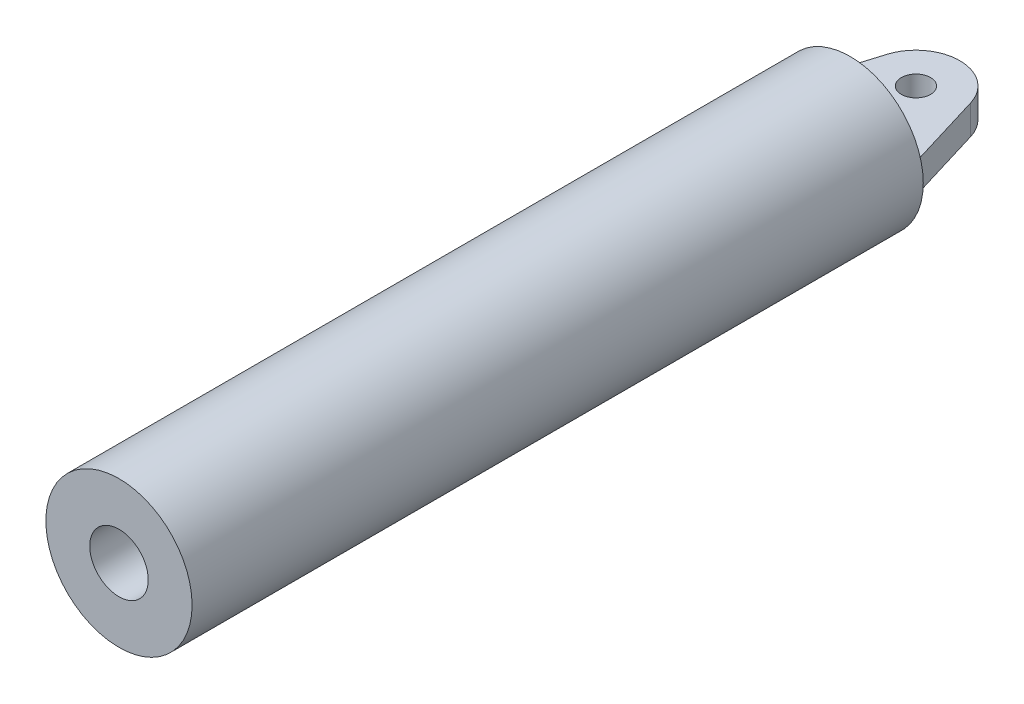
ISO-10303-21;
HEADER;
FILE_DESCRIPTION(('STEP AP214'),'2;1');
FILE_NAME('part.step','',(''),(''),'','','');
FILE_SCHEMA(('AUTOMOTIVE_DESIGN { 1 0 10303 214 1 1 1 1 }'));
ENDSEC;
DATA;
#1=APPLICATION_CONTEXT('core data for automotive mechanical design processes');
#2=APPLICATION_PROTOCOL_DEFINITION('international standard','automotive_design',2000,#1);
#3=PRODUCT_CONTEXT('',#1,'mechanical');
#4=PRODUCT('Part','Part','',(#3));
#5=PRODUCT_RELATED_PRODUCT_CATEGORY('part','',(#4));
#6=PRODUCT_DEFINITION_FORMATION('','',#4);
#7=PRODUCT_DEFINITION_CONTEXT('part definition',#1,'design');
#8=PRODUCT_DEFINITION('design','',#6,#7);
#9=PRODUCT_DEFINITION_SHAPE('','',#8);
#10=(LENGTH_UNIT() NAMED_UNIT(*) SI_UNIT(.MILLI.,.METRE.));
#11=(NAMED_UNIT(*) PLANE_ANGLE_UNIT() SI_UNIT($,.RADIAN.));
#12=(NAMED_UNIT(*) SI_UNIT($,.STERADIAN.) SOLID_ANGLE_UNIT());
#13=UNCERTAINTY_MEASURE_WITH_UNIT(LENGTH_MEASURE(1.E-05),#10,'distance_accuracy_value','');
#14=(GEOMETRIC_REPRESENTATION_CONTEXT(3) GLOBAL_UNCERTAINTY_ASSIGNED_CONTEXT((#13)) GLOBAL_UNIT_ASSIGNED_CONTEXT((#10,
#11,#12)) REPRESENTATION_CONTEXT('',''));
#15=CARTESIAN_POINT('',(0.,0.,0.));
#16=DIRECTION('',(0.,0.,1.));
#17=DIRECTION('',(1.,0.,0.));
#18=AXIS2_PLACEMENT_3D('',#15,#16,#17);
#19=CARTESIAN_POINT('',(0.,0.,0.));
#20=DIRECTION('',(0.,0.,1.));
#21=DIRECTION('',(1.,0.,0.));
#22=AXIS2_PLACEMENT_3D('',#19,#20,#21);
#23=PLANE('',#22);
#24=CARTESIAN_POINT('',(0.,0.,0.));
#25=DIRECTION('',(0.,0.,1.));
#26=DIRECTION('',(1.,0.,0.));
#27=AXIS2_PLACEMENT_3D('',#24,#25,#26);
#28=CIRCLE('',#27,50.);
#29=CARTESIAN_POINT('',(50.,0.,0.));
#30=VERTEX_POINT('',#29);
#31=EDGE_CURVE('E36',#30,#30,#28,.T.);
#32=ORIENTED_EDGE('',*,*,#31,.F.);
#33=EDGE_LOOP('',(#32));
#34=FACE_BOUND('',#33,.T.);
#35=DIRECTION('',(0.,-1.,0.));
#36=VECTOR('',#35,1.);
#37=CARTESIAN_POINT('',(45.,10.,0.));
#38=LINE('',#37,#36);
#39=CARTESIAN_POINT('',(45.,10.,0.));
#40=VERTEX_POINT('',#39);
#41=CARTESIAN_POINT('',(45.,-10.,0.));
#42=VERTEX_POINT('',#41);
#43=EDGE_CURVE('E47',#40,#42,#38,.T.);
#44=ORIENTED_EDGE('',*,*,#43,.F.);
#45=DIRECTION('',(1.,0.,0.));
#46=VECTOR('',#45,1.);
#47=CARTESIAN_POINT('',(-45.,10.,0.));
#48=LINE('',#47,#46);
#49=CARTESIAN_POINT('',(-45.,10.,0.));
#50=VERTEX_POINT('',#49);
#51=EDGE_CURVE('E79',#50,#40,#48,.T.);
#52=ORIENTED_EDGE('',*,*,#51,.F.);
#53=DIRECTION('',(0.,-1.,0.));
#54=VECTOR('',#53,1.);
#55=CARTESIAN_POINT('',(-45.,10.,0.));
#56=LINE('',#55,#54);
#57=CARTESIAN_POINT('',(-45.,-10.,0.));
#58=VERTEX_POINT('',#57);
#59=EDGE_CURVE('E95',#50,#58,#56,.T.);
#60=ORIENTED_EDGE('',*,*,#59,.T.);
#61=DIRECTION('',(1.,0.,0.));
#62=VECTOR('',#61,1.);
#63=CARTESIAN_POINT('',(-45.,-10.,0.));
#64=LINE('',#63,#62);
#65=EDGE_CURVE('E52',#58,#42,#64,.T.);
#66=ORIENTED_EDGE('',*,*,#65,.T.);
#67=EDGE_LOOP('',(#44,#52,#60,#66));
#68=FACE_BOUND('',#67,.T.);
#69=ADVANCED_FACE('F32',(#34,#68),#23,.F.);
#70=CARTESIAN_POINT('',(0.,0.,500.));
#71=DIRECTION('',(0.,0.,-1.));
#72=DIRECTION('',(-1.,0.,0.));
#73=AXIS2_PLACEMENT_3D('',#70,#71,#72);
#74=CYLINDRICAL_SURFACE('',#73,50.);
#75=CARTESIAN_POINT('',(0.,0.,500.));
#76=DIRECTION('',(0.,0.,1.));
#77=DIRECTION('',(1.,0.,0.));
#78=AXIS2_PLACEMENT_3D('',#75,#76,#77);
#79=CIRCLE('',#78,50.);
#80=CARTESIAN_POINT('',(50.,0.,500.));
#81=VERTEX_POINT('',#80);
#82=EDGE_CURVE('E11',#81,#81,#79,.T.);
#83=ORIENTED_EDGE('',*,*,#82,.F.);
#84=EDGE_LOOP('',(#83));
#85=FACE_BOUND('',#84,.T.);
#86=ORIENTED_EDGE('',*,*,#31,.T.);
#87=EDGE_LOOP('',(#86));
#88=FACE_BOUND('',#87,.T.);
#89=ADVANCED_FACE('F34',(#85,#88),#74,.T.);
#90=CARTESIAN_POINT('',(0.,0.,500.));
#91=DIRECTION('',(0.,0.,1.));
#92=DIRECTION('',(1.,0.,0.));
#93=AXIS2_PLACEMENT_3D('',#90,#91,#92);
#94=PLANE('',#93);
#95=CARTESIAN_POINT('',(0.,0.,500.));
#96=DIRECTION('',(0.,0.,1.));
#97=DIRECTION('',(1.,0.,0.));
#98=AXIS2_PLACEMENT_3D('',#95,#96,#97);
#99=CIRCLE('',#98,20.);
#100=CARTESIAN_POINT('',(20.,0.,500.));
#101=VERTEX_POINT('',#100);
#102=EDGE_CURVE('E154',#101,#101,#99,.T.);
#103=ORIENTED_EDGE('',*,*,#102,.F.);
#104=EDGE_LOOP('',(#103));
#105=FACE_BOUND('',#104,.T.);
#106=ORIENTED_EDGE('',*,*,#82,.T.);
#107=EDGE_LOOP('',(#106));
#108=FACE_BOUND('',#107,.T.);
#109=ADVANCED_FACE('F117',(#105,#108),#94,.T.);
#110=CARTESIAN_POINT('',(0.,10.,-45.));
#111=DIRECTION('',(0.,-1.,0.));
#112=DIRECTION('',(0.,0.,-1.));
#113=AXIS2_PLACEMENT_3D('',#110,#111,#112);
#114=PLANE('',#113);
#115=ORIENTED_EDGE('',*,*,#51,.T.);
#116=DIRECTION('',(-0.29027623112899,0.,-0.956942897795657));
#117=VECTOR('',#116,1.);
#118=CARTESIAN_POINT('',(28.7082869338697,10.,-53.7082869338697));
#119=LINE('',#118,#117);
#120=CARTESIAN_POINT('',(28.7082869338697,10.,-53.7082869338697));
#121=VERTEX_POINT('',#120);
#122=EDGE_CURVE('E71',#40,#121,#119,.T.);
#123=ORIENTED_EDGE('',*,*,#122,.T.);
#124=CARTESIAN_POINT('',(0.,10.,-45.));
#125=DIRECTION('',(0.,1.,0.));
#126=DIRECTION('',(0.,0.,-1.));
#127=AXIS2_PLACEMENT_3D('',#124,#125,#126);
#128=CIRCLE('',#127,30.);
#129=CARTESIAN_POINT('',(-28.7082869338697,10.,-53.7082869338697));
#130=VERTEX_POINT('',#129);
#131=EDGE_CURVE('E77',#121,#130,#128,.T.);
#132=ORIENTED_EDGE('',*,*,#131,.T.);
#133=DIRECTION('',(-0.29027623112899,0.,0.956942897795657));
#134=VECTOR('',#133,1.);
#135=CARTESIAN_POINT('',(-45.,10.,0.));
#136=LINE('',#135,#134);
#137=EDGE_CURVE('E93',#130,#50,#136,.T.);
#138=ORIENTED_EDGE('',*,*,#137,.T.);
#139=EDGE_LOOP('',(#115,#123,#132,#138));
#140=FACE_BOUND('',#139,.T.);
#141=CARTESIAN_POINT('',(0.,10.,-45.));
#142=DIRECTION('',(0.,1.,0.));
#143=DIRECTION('',(0.,0.,1.));
#144=AXIS2_PLACEMENT_3D('',#141,#142,#143);
#145=CIRCLE('',#144,9.99999999999999);
#146=CARTESIAN_POINT('',(0.,10.,-35.));
#147=VERTEX_POINT('',#146);
#148=EDGE_CURVE('E100',#147,#147,#145,.T.);
#149=ORIENTED_EDGE('',*,*,#148,.F.);
#150=EDGE_LOOP('',(#149));
#151=FACE_BOUND('',#150,.T.);
#152=ADVANCED_FACE('F73',(#140,#151),#114,.F.);
#153=CARTESIAN_POINT('',(0.,-10.,-45.));
#154=DIRECTION('',(0.,-1.,0.));
#155=DIRECTION('',(0.,0.,-1.));
#156=AXIS2_PLACEMENT_3D('',#153,#154,#155);
#157=PLANE('',#156);
#158=ORIENTED_EDGE('',*,*,#65,.F.);
#159=DIRECTION('',(-0.29027623112899,0.,0.956942897795657));
#160=VECTOR('',#159,1.);
#161=CARTESIAN_POINT('',(-45.,-10.,0.));
#162=LINE('',#161,#160);
#163=CARTESIAN_POINT('',(-28.7082869338697,-10.,-53.7082869338697));
#164=VERTEX_POINT('',#163);
#165=EDGE_CURVE('E104',#164,#58,#162,.T.);
#166=ORIENTED_EDGE('',*,*,#165,.F.);
#167=CARTESIAN_POINT('',(0.,-10.,-45.));
#168=DIRECTION('',(0.,1.,0.));
#169=DIRECTION('',(0.,0.,-1.));
#170=AXIS2_PLACEMENT_3D('',#167,#168,#169);
#171=CIRCLE('',#170,30.);
#172=CARTESIAN_POINT('',(28.7082869338697,-10.,-53.7082869338697));
#173=VERTEX_POINT('',#172);
#174=EDGE_CURVE('E102',#173,#164,#171,.T.);
#175=ORIENTED_EDGE('',*,*,#174,.F.);
#176=DIRECTION('',(-0.29027623112899,0.,-0.956942897795657));
#177=VECTOR('',#176,1.);
#178=CARTESIAN_POINT('',(28.7082869338697,-10.,-53.7082869338697));
#179=LINE('',#178,#177);
#180=EDGE_CURVE('E85',#42,#173,#179,.T.);
#181=ORIENTED_EDGE('',*,*,#180,.F.);
#182=EDGE_LOOP('',(#158,#166,#175,#181));
#183=FACE_BOUND('',#182,.T.);
#184=CARTESIAN_POINT('',(0.,-10.,-45.));
#185=DIRECTION('',(0.,1.,0.));
#186=DIRECTION('',(0.,0.,1.));
#187=AXIS2_PLACEMENT_3D('',#184,#185,#186);
#188=CIRCLE('',#187,9.99999999999999);
#189=CARTESIAN_POINT('',(0.,-10.,-35.));
#190=VERTEX_POINT('',#189);
#191=EDGE_CURVE('E157',#190,#190,#188,.T.);
#192=ORIENTED_EDGE('',*,*,#191,.T.);
#193=EDGE_LOOP('',(#192));
#194=FACE_BOUND('',#193,.T.);
#195=ADVANCED_FACE('F125',(#183,#194),#157,.T.);
#196=CARTESIAN_POINT('',(28.7082869338697,10.,-53.7082869338697));
#197=DIRECTION('',(-0.956942897795657,0.,0.29027623112899));
#198=DIRECTION('',(0.29027623112899,0.,0.956942897795657));
#199=AXIS2_PLACEMENT_3D('',#196,#197,#198);
#200=PLANE('',#199);
#201=ORIENTED_EDGE('',*,*,#180,.T.);
#202=DIRECTION('',(0.,-1.,0.));
#203=VECTOR('',#202,1.);
#204=CARTESIAN_POINT('',(28.7082869338697,10.,-53.7082869338697));
#205=LINE('',#204,#203);
#206=EDGE_CURVE('E83',#121,#173,#205,.T.);
#207=ORIENTED_EDGE('',*,*,#206,.F.);
#208=ORIENTED_EDGE('',*,*,#122,.F.);
#209=ORIENTED_EDGE('',*,*,#43,.T.);
#210=EDGE_LOOP('',(#201,#207,#208,#209));
#211=FACE_BOUND('',#210,.T.);
#212=ADVANCED_FACE('F84',(#211),#200,.F.);
#213=CARTESIAN_POINT('',(0.,10.,-45.));
#214=DIRECTION('',(0.,-1.,0.));
#215=DIRECTION('',(0.,0.,-1.));
#216=AXIS2_PLACEMENT_3D('',#213,#214,#215);
#217=CYLINDRICAL_SURFACE('',#216,30.);
#218=ORIENTED_EDGE('',*,*,#174,.T.);
#219=DIRECTION('',(0.,-1.,0.));
#220=VECTOR('',#219,1.);
#221=CARTESIAN_POINT('',(-28.7082869338697,10.,-53.7082869338697));
#222=LINE('',#221,#220);
#223=EDGE_CURVE('E88',#130,#164,#222,.T.);
#224=ORIENTED_EDGE('',*,*,#223,.F.);
#225=ORIENTED_EDGE('',*,*,#131,.F.);
#226=ORIENTED_EDGE('',*,*,#206,.T.);
#227=EDGE_LOOP('',(#218,#224,#225,#226));
#228=FACE_BOUND('',#227,.T.);
#229=ADVANCED_FACE('F90',(#228),#217,.T.);
#230=CARTESIAN_POINT('',(-45.,10.,0.));
#231=DIRECTION('',(0.956942897795657,0.,0.29027623112899));
#232=DIRECTION('',(0.29027623112899,0.,-0.956942897795657));
#233=AXIS2_PLACEMENT_3D('',#230,#231,#232);
#234=PLANE('',#233);
#235=ORIENTED_EDGE('',*,*,#165,.T.);
#236=ORIENTED_EDGE('',*,*,#59,.F.);
#237=ORIENTED_EDGE('',*,*,#137,.F.);
#238=ORIENTED_EDGE('',*,*,#223,.T.);
#239=EDGE_LOOP('',(#235,#236,#237,#238));
#240=FACE_BOUND('',#239,.T.);
#241=ADVANCED_FACE('F128',(#240),#234,.F.);
#242=CARTESIAN_POINT('',(0.,10.,-45.));
#243=DIRECTION('',(0.,-1.,0.));
#244=DIRECTION('',(0.,0.,-1.));
#245=AXIS2_PLACEMENT_3D('',#242,#243,#244);
#246=CYLINDRICAL_SURFACE('',#245,9.99999999999999);
#247=ORIENTED_EDGE('',*,*,#148,.T.);
#248=EDGE_LOOP('',(#247));
#249=FACE_BOUND('',#248,.T.);
#250=ORIENTED_EDGE('',*,*,#191,.F.);
#251=EDGE_LOOP('',(#250));
#252=FACE_BOUND('',#251,.T.);
#253=ADVANCED_FACE('F131',(#249,#252),#246,.F.);
#254=CARTESIAN_POINT('',(0.,0.,30.));
#255=DIRECTION('',(0.,0.,1.));
#256=DIRECTION('',(1.,0.,0.));
#257=AXIS2_PLACEMENT_3D('',#254,#255,#256);
#258=PLANE('',#257);
#259=CARTESIAN_POINT('',(0.,0.,30.));
#260=DIRECTION('',(0.,0.,1.));
#261=DIRECTION('',(1.,0.,0.));
#262=AXIS2_PLACEMENT_3D('',#259,#260,#261);
#263=CIRCLE('',#262,20.);
#264=CARTESIAN_POINT('',(20.,0.,30.));
#265=VERTEX_POINT('',#264);
#266=EDGE_CURVE('E152',#265,#265,#263,.T.);
#267=ORIENTED_EDGE('',*,*,#266,.T.);
#268=EDGE_LOOP('',(#267));
#269=FACE_BOUND('',#268,.T.);
#270=ADVANCED_FACE('F140',(#269),#258,.T.);
#271=CARTESIAN_POINT('',(0.,0.,500.));
#272=DIRECTION('',(0.,0.,-1.));
#273=DIRECTION('',(-1.,0.,0.));
#274=AXIS2_PLACEMENT_3D('',#271,#272,#273);
#275=CYLINDRICAL_SURFACE('',#274,20.);
#276=ORIENTED_EDGE('',*,*,#102,.T.);
#277=EDGE_LOOP('',(#276));
#278=FACE_BOUND('',#277,.T.);
#279=ORIENTED_EDGE('',*,*,#266,.F.);
#280=EDGE_LOOP('',(#279));
#281=FACE_BOUND('',#280,.T.);
#282=ADVANCED_FACE('F142',(#278,#281),#275,.F.);
#283=CLOSED_SHELL('',(#69,#89,#109,#152,#195,#212,#229,#241,#253,#270,#282));
#284=MANIFOLD_SOLID_BREP('B2',#283);
#285=ADVANCED_BREP_SHAPE_REPRESENTATION('',(#18,#284),#14);
#286=SHAPE_DEFINITION_REPRESENTATION(#9,#285);
ENDSEC;
END-ISO-10303-21;
